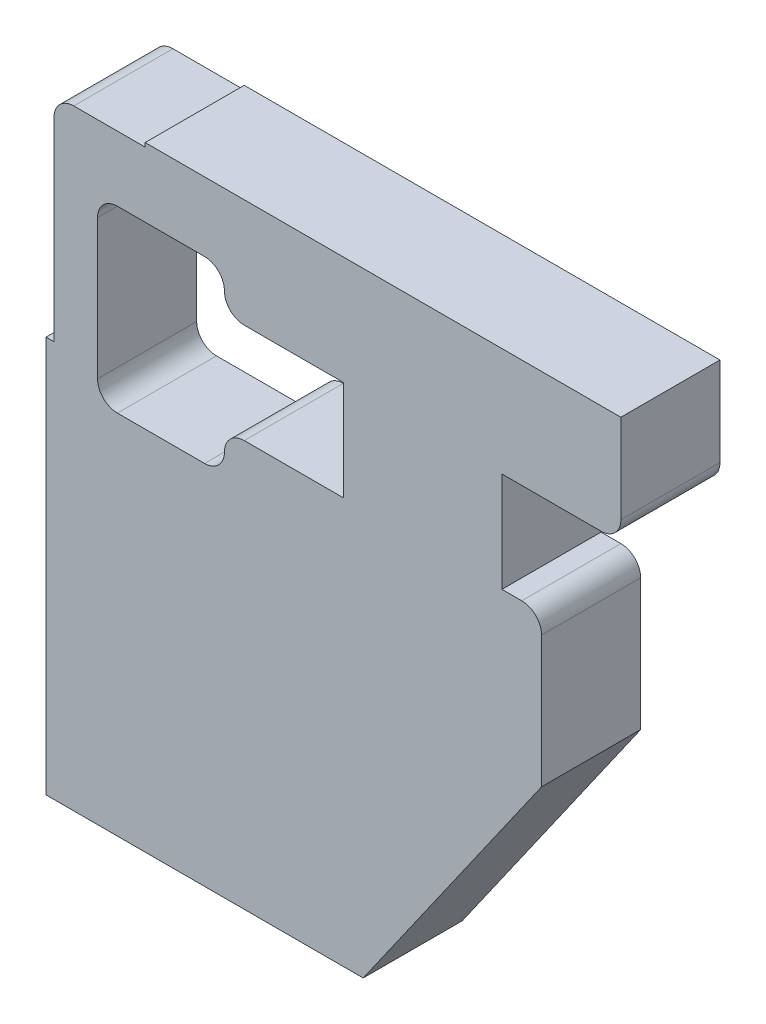
ISO-10303-21;
HEADER;
FILE_DESCRIPTION(('STEP AP214'),'2;1');
FILE_NAME('part.step','',(''),(''),'','','');
FILE_SCHEMA(('AUTOMOTIVE_DESIGN { 1 0 10303 214 1 1 1 1 }'));
ENDSEC;
DATA;
#1=APPLICATION_CONTEXT('core data for automotive mechanical design processes');
#2=APPLICATION_PROTOCOL_DEFINITION('international standard','automotive_design',2000,#1);
#3=PRODUCT_CONTEXT('',#1,'mechanical');
#4=PRODUCT('Part','Part','',(#3));
#5=PRODUCT_RELATED_PRODUCT_CATEGORY('part','',(#4));
#6=PRODUCT_DEFINITION_FORMATION('','',#4);
#7=PRODUCT_DEFINITION_CONTEXT('part definition',#1,'design');
#8=PRODUCT_DEFINITION('design','',#6,#7);
#9=PRODUCT_DEFINITION_SHAPE('','',#8);
#10=(LENGTH_UNIT() NAMED_UNIT(*) SI_UNIT(.MILLI.,.METRE.));
#11=(NAMED_UNIT(*) PLANE_ANGLE_UNIT() SI_UNIT($,.RADIAN.));
#12=(NAMED_UNIT(*) SI_UNIT($,.STERADIAN.) SOLID_ANGLE_UNIT());
#13=UNCERTAINTY_MEASURE_WITH_UNIT(LENGTH_MEASURE(1.E-05),#10,'distance_accuracy_value','');
#14=(GEOMETRIC_REPRESENTATION_CONTEXT(3) GLOBAL_UNCERTAINTY_ASSIGNED_CONTEXT((#13)) GLOBAL_UNIT_ASSIGNED_CONTEXT((#10,
#11,#12)) REPRESENTATION_CONTEXT('',''));
#15=CARTESIAN_POINT('',(0.,0.,0.));
#16=DIRECTION('',(0.,0.,1.));
#17=DIRECTION('',(1.,0.,0.));
#18=AXIS2_PLACEMENT_3D('',#15,#16,#17);
#19=CARTESIAN_POINT('',(0.,0.,0.125));
#20=DIRECTION('',(0.,0.,-1.));
#21=DIRECTION('',(-1.,0.,0.));
#22=AXIS2_PLACEMENT_3D('',#19,#20,#21);
#23=PLANE('',#22);
#24=DIRECTION('',(0.,1.,0.));
#25=VECTOR('',#24,1.);
#26=CARTESIAN_POINT('',(1.3,-0.957333396966045,0.125));
#27=LINE('',#26,#25);
#28=CARTESIAN_POINT('',(1.3,-0.957333396966045,0.125));
#29=VERTEX_POINT('',#28);
#30=CARTESIAN_POINT('',(1.3,-0.626,0.125));
#31=VERTEX_POINT('',#30);
#32=EDGE_CURVE('E290',#29,#31,#27,.T.);
#33=ORIENTED_EDGE('',*,*,#32,.T.);
#34=CARTESIAN_POINT('',(1.25,-0.626,0.125));
#35=DIRECTION('',(0.,0.,-1.));
#36=DIRECTION('',(-1.,0.,0.));
#37=AXIS2_PLACEMENT_3D('',#34,#35,#36);
#38=CIRCLE('',#37,0.05);
#39=CARTESIAN_POINT('',(1.25,-0.576,0.125));
#40=VERTEX_POINT('',#39);
#41=EDGE_CURVE('E379',#31,#40,#38,.F.);
#42=ORIENTED_EDGE('',*,*,#41,.T.);
#43=DIRECTION('',(-1.,0.,0.));
#44=VECTOR('',#43,1.);
#45=CARTESIAN_POINT('',(1.3,-0.576,0.125));
#46=LINE('',#45,#44);
#47=CARTESIAN_POINT('',(1.2,-0.576,0.125));
#48=VERTEX_POINT('',#47);
#49=EDGE_CURVE('E293',#40,#48,#46,.T.);
#50=ORIENTED_EDGE('',*,*,#49,.T.);
#51=DIRECTION('',(0.,1.,0.));
#52=VECTOR('',#51,1.);
#53=CARTESIAN_POINT('',(1.2,-0.576,0.125));
#54=LINE('',#53,#52);
#55=CARTESIAN_POINT('',(1.2,-0.324,0.125));
#56=VERTEX_POINT('',#55);
#57=EDGE_CURVE('E295',#48,#56,#54,.T.);
#58=ORIENTED_EDGE('',*,*,#57,.T.);
#59=DIRECTION('',(1.,0.,0.));
#60=VECTOR('',#59,1.);
#61=CARTESIAN_POINT('',(1.2,-0.324,0.125));
#62=LINE('',#61,#60);
#63=CARTESIAN_POINT('',(1.45,-0.324,0.125));
#64=VERTEX_POINT('',#63);
#65=EDGE_CURVE('E297',#56,#64,#62,.T.);
#66=ORIENTED_EDGE('',*,*,#65,.T.);
#67=CARTESIAN_POINT('',(1.45,-0.274,0.125));
#68=DIRECTION('',(0.,0.,-1.));
#69=DIRECTION('',(-1.,0.,0.));
#70=AXIS2_PLACEMENT_3D('',#67,#68,#69);
#71=CIRCLE('',#70,0.05);
#72=CARTESIAN_POINT('',(1.5,-0.274,0.125));
#73=VERTEX_POINT('',#72);
#74=EDGE_CURVE('E377',#64,#73,#71,.F.);
#75=ORIENTED_EDGE('',*,*,#74,.T.);
#76=DIRECTION('',(0.,1.,0.));
#77=VECTOR('',#76,1.);
#78=CARTESIAN_POINT('',(1.5,-0.324,0.125));
#79=LINE('',#78,#77);
#80=CARTESIAN_POINT('',(1.5,-0.05,0.125));
#81=VERTEX_POINT('',#80);
#82=EDGE_CURVE('E270',#73,#81,#79,.T.);
#83=ORIENTED_EDGE('',*,*,#82,.T.);
#84=DIRECTION('',(-1.,0.,0.));
#85=VECTOR('',#84,1.);
#86=CARTESIAN_POINT('',(0.3,-0.05,0.125));
#87=LINE('',#86,#85);
#88=CARTESIAN_POINT('',(0.3,-0.05,0.125));
#89=VERTEX_POINT('',#88);
#90=EDGE_CURVE('E272',#81,#89,#87,.T.);
#91=ORIENTED_EDGE('',*,*,#90,.T.);
#92=DIRECTION('',(0.,-1.,0.));
#93=VECTOR('',#92,1.);
#94=CARTESIAN_POINT('',(0.3,-0.05,0.125));
#95=LINE('',#94,#93);
#96=CARTESIAN_POINT('',(0.3,-0.06,0.125));
#97=VERTEX_POINT('',#96);
#98=EDGE_CURVE('E275',#89,#97,#95,.T.);
#99=ORIENTED_EDGE('',*,*,#98,.T.);
#100=DIRECTION('',(-1.,0.,0.));
#101=VECTOR('',#100,1.);
#102=CARTESIAN_POINT('',(0.3,-0.06,0.125));
#103=LINE('',#102,#101);
#104=CARTESIAN_POINT('',(0.12,-0.06,0.125));
#105=VERTEX_POINT('',#104);
#106=EDGE_CURVE('E277',#97,#105,#103,.T.);
#107=ORIENTED_EDGE('',*,*,#106,.T.);
#108=CARTESIAN_POINT('',(0.12,-0.11,0.125));
#109=DIRECTION('',(0.,0.,-1.));
#110=DIRECTION('',(-1.,0.,0.));
#111=AXIS2_PLACEMENT_3D('',#108,#109,#110);
#112=CIRCLE('',#111,0.05);
#113=CARTESIAN_POINT('',(0.07,-0.11,0.125));
#114=VERTEX_POINT('',#113);
#115=EDGE_CURVE('E372',#105,#114,#112,.F.);
#116=ORIENTED_EDGE('',*,*,#115,.T.);
#117=DIRECTION('',(0.,-1.,0.));
#118=VECTOR('',#117,1.);
#119=CARTESIAN_POINT('',(0.07,-0.06,0.125));
#120=LINE('',#119,#118);
#121=CARTESIAN_POINT('',(0.07,-0.6,0.125));
#122=VERTEX_POINT('',#121);
#123=EDGE_CURVE('E280',#114,#122,#120,.T.);
#124=ORIENTED_EDGE('',*,*,#123,.T.);
#125=DIRECTION('',(-1.,0.,0.));
#126=VECTOR('',#125,1.);
#127=CARTESIAN_POINT('',(0.05,-0.6,0.125));
#128=LINE('',#127,#126);
#129=CARTESIAN_POINT('',(0.05,-0.6,0.125));
#130=VERTEX_POINT('',#129);
#131=EDGE_CURVE('E282',#122,#130,#128,.T.);
#132=ORIENTED_EDGE('',*,*,#131,.T.);
#133=DIRECTION('',(0.,-1.,0.));
#134=VECTOR('',#133,1.);
#135=CARTESIAN_POINT('',(0.05,-0.6,0.125));
#136=LINE('',#135,#134);
#137=CARTESIAN_POINT('',(0.0500000000000001,-1.6,0.125));
#138=VERTEX_POINT('',#137);
#139=EDGE_CURVE('E284',#130,#138,#136,.T.);
#140=ORIENTED_EDGE('',*,*,#139,.T.);
#141=DIRECTION('',(1.,0.,0.));
#142=VECTOR('',#141,1.);
#143=CARTESIAN_POINT('',(0.0500000000000001,-1.6,0.125));
#144=LINE('',#143,#142);
#145=CARTESIAN_POINT('',(0.85,-1.6,0.125));
#146=VERTEX_POINT('',#145);
#147=EDGE_CURVE('E286',#138,#146,#144,.T.);
#148=ORIENTED_EDGE('',*,*,#147,.T.);
#149=DIRECTION('',(0.573576436351044,0.819152044288993,0.));
#150=VECTOR('',#149,1.);
#151=CARTESIAN_POINT('',(0.85,-1.6,0.125));
#152=LINE('',#151,#150);
#153=EDGE_CURVE('E288',#146,#29,#152,.T.);
#154=ORIENTED_EDGE('',*,*,#153,.T.);
#155=EDGE_LOOP('',(#33,#42,#50,#58,#66,#75,#83,#91,#99,#107,#116,#124,#132,#140,#148,#154));
#156=FACE_BOUND('',#155,.T.);
#157=DIRECTION('',(-1.,0.,0.));
#158=VECTOR('',#157,1.);
#159=CARTESIAN_POINT('',(0.18,-0.224,0.125));
#160=LINE('',#159,#158);
#161=CARTESIAN_POINT('',(0.45,-0.224,0.125));
#162=VERTEX_POINT('',#161);
#163=CARTESIAN_POINT('',(0.23,-0.224,0.125));
#164=VERTEX_POINT('',#163);
#165=EDGE_CURVE('E243',#162,#164,#160,.T.);
#166=ORIENTED_EDGE('',*,*,#165,.F.);
#167=CARTESIAN_POINT('',(0.45,-0.274,0.125));
#168=DIRECTION('',(0.,0.,-1.));
#169=DIRECTION('',(-1.,0.,0.));
#170=AXIS2_PLACEMENT_3D('',#167,#168,#169);
#171=CIRCLE('',#170,0.05);
#172=CARTESIAN_POINT('',(0.5,-0.274,0.125));
#173=VERTEX_POINT('',#172);
#174=EDGE_CURVE('E55',#162,#173,#171,.T.);
#175=ORIENTED_EDGE('',*,*,#174,.T.);
#176=CARTESIAN_POINT('',(0.55,-0.274,0.125));
#177=DIRECTION('',(0.,0.,-1.));
#178=DIRECTION('',(-1.,0.,0.));
#179=AXIS2_PLACEMENT_3D('',#176,#177,#178);
#180=CIRCLE('',#179,0.05);
#181=CARTESIAN_POINT('',(0.55,-0.324,0.125));
#182=VERTEX_POINT('',#181);
#183=EDGE_CURVE('E50',#173,#182,#180,.F.);
#184=ORIENTED_EDGE('',*,*,#183,.T.);
#185=DIRECTION('',(-1.,0.,0.));
#186=VECTOR('',#185,1.);
#187=CARTESIAN_POINT('',(0.5,-0.324,0.125));
#188=LINE('',#187,#186);
#189=CARTESIAN_POINT('',(0.8,-0.324,0.125));
#190=VERTEX_POINT('',#189);
#191=EDGE_CURVE('E241',#190,#182,#188,.T.);
#192=ORIENTED_EDGE('',*,*,#191,.F.);
#193=DIRECTION('',(0.,1.,0.));
#194=VECTOR('',#193,1.);
#195=CARTESIAN_POINT('',(0.8,-0.324,0.125));
#196=LINE('',#195,#194);
#197=CARTESIAN_POINT('',(0.8,-0.576,0.125));
#198=VERTEX_POINT('',#197);
#199=EDGE_CURVE('E229',#198,#190,#196,.T.);
#200=ORIENTED_EDGE('',*,*,#199,.F.);
#201=DIRECTION('',(1.,0.,0.));
#202=VECTOR('',#201,1.);
#203=CARTESIAN_POINT('',(0.8,-0.576,0.125));
#204=LINE('',#203,#202);
#205=CARTESIAN_POINT('',(0.55,-0.576,0.125));
#206=VERTEX_POINT('',#205);
#207=EDGE_CURVE('E221',#206,#198,#204,.T.);
#208=ORIENTED_EDGE('',*,*,#207,.F.);
#209=CARTESIAN_POINT('',(0.55,-0.626,0.125));
#210=DIRECTION('',(0.,0.,-1.));
#211=DIRECTION('',(-1.,0.,0.));
#212=AXIS2_PLACEMENT_3D('',#209,#210,#211);
#213=CIRCLE('',#212,0.05);
#214=CARTESIAN_POINT('',(0.5,-0.626,0.125));
#215=VERTEX_POINT('',#214);
#216=EDGE_CURVE('E374',#206,#215,#213,.F.);
#217=ORIENTED_EDGE('',*,*,#216,.T.);
#218=CARTESIAN_POINT('',(0.45,-0.626,0.125));
#219=DIRECTION('',(0.,0.,-1.));
#220=DIRECTION('',(-1.,0.,0.));
#221=AXIS2_PLACEMENT_3D('',#218,#219,#220);
#222=CIRCLE('',#221,0.05);
#223=CARTESIAN_POINT('',(0.45,-0.676,0.125));
#224=VERTEX_POINT('',#223);
#225=EDGE_CURVE('E411',#215,#224,#222,.T.);
#226=ORIENTED_EDGE('',*,*,#225,.T.);
#227=DIRECTION('',(1.,0.,0.));
#228=VECTOR('',#227,1.);
#229=CARTESIAN_POINT('',(0.5,-0.676,0.125));
#230=LINE('',#229,#228);
#231=CARTESIAN_POINT('',(0.23,-0.676,0.125));
#232=VERTEX_POINT('',#231);
#233=EDGE_CURVE('E251',#232,#224,#230,.T.);
#234=ORIENTED_EDGE('',*,*,#233,.F.);
#235=CARTESIAN_POINT('',(0.23,-0.626,0.125));
#236=DIRECTION('',(0.,0.,-1.));
#237=DIRECTION('',(-1.,0.,0.));
#238=AXIS2_PLACEMENT_3D('',#235,#236,#237);
#239=CIRCLE('',#238,0.05);
#240=CARTESIAN_POINT('',(0.18,-0.626,0.125));
#241=VERTEX_POINT('',#240);
#242=EDGE_CURVE('E415',#232,#241,#239,.T.);
#243=ORIENTED_EDGE('',*,*,#242,.T.);
#244=DIRECTION('',(0.,-1.,0.));
#245=VECTOR('',#244,1.);
#246=CARTESIAN_POINT('',(0.18,-0.676,0.125));
#247=LINE('',#246,#245);
#248=CARTESIAN_POINT('',(0.18,-0.274,0.125));
#249=VERTEX_POINT('',#248);
#250=EDGE_CURVE('E248',#249,#241,#247,.T.);
#251=ORIENTED_EDGE('',*,*,#250,.F.);
#252=CARTESIAN_POINT('',(0.23,-0.274,0.125));
#253=DIRECTION('',(0.,0.,-1.));
#254=DIRECTION('',(-1.,0.,0.));
#255=AXIS2_PLACEMENT_3D('',#252,#253,#254);
#256=CIRCLE('',#255,0.05);
#257=EDGE_CURVE('E11',#249,#164,#256,.T.);
#258=ORIENTED_EDGE('',*,*,#257,.T.);
#259=EDGE_LOOP('',(#166,#175,#184,#192,#200,#208,#217,#226,#234,#243,#251,#258));
#260=FACE_BOUND('',#259,.T.);
#261=ADVANCED_FACE('F33',(#156,#260),#23,.F.);
#262=CARTESIAN_POINT('',(0.,0.,-0.125));
#263=DIRECTION('',(0.,0.,-1.));
#264=DIRECTION('',(-1.,0.,0.));
#265=AXIS2_PLACEMENT_3D('',#262,#263,#264);
#266=PLANE('',#265);
#267=DIRECTION('',(-1.,0.,0.));
#268=VECTOR('',#267,1.);
#269=CARTESIAN_POINT('',(1.3,-0.576,-0.125));
#270=LINE('',#269,#268);
#271=CARTESIAN_POINT('',(1.25,-0.576,-0.125));
#272=VERTEX_POINT('',#271);
#273=CARTESIAN_POINT('',(1.2,-0.576,-0.125));
#274=VERTEX_POINT('',#273);
#275=EDGE_CURVE('E322',#272,#274,#270,.T.);
#276=ORIENTED_EDGE('',*,*,#275,.F.);
#277=CARTESIAN_POINT('',(1.25,-0.626,-0.125));
#278=DIRECTION('',(0.,0.,-1.));
#279=DIRECTION('',(-1.,0.,0.));
#280=AXIS2_PLACEMENT_3D('',#277,#278,#279);
#281=CIRCLE('',#280,0.05);
#282=CARTESIAN_POINT('',(1.3,-0.626,-0.125));
#283=VERTEX_POINT('',#282);
#284=EDGE_CURVE('E368',#272,#283,#281,.T.);
#285=ORIENTED_EDGE('',*,*,#284,.T.);
#286=DIRECTION('',(0.,1.,0.));
#287=VECTOR('',#286,1.);
#288=CARTESIAN_POINT('',(1.3,-0.957333396966045,-0.125));
#289=LINE('',#288,#287);
#290=CARTESIAN_POINT('',(1.3,-0.957333396966045,-0.125));
#291=VERTEX_POINT('',#290);
#292=EDGE_CURVE('E319',#291,#283,#289,.T.);
#293=ORIENTED_EDGE('',*,*,#292,.F.);
#294=DIRECTION('',(0.573576436351044,0.819152044288993,0.));
#295=VECTOR('',#294,1.);
#296=CARTESIAN_POINT('',(0.85,-1.6,-0.125));
#297=LINE('',#296,#295);
#298=CARTESIAN_POINT('',(0.85,-1.6,-0.125));
#299=VERTEX_POINT('',#298);
#300=EDGE_CURVE('E317',#299,#291,#297,.T.);
#301=ORIENTED_EDGE('',*,*,#300,.F.);
#302=DIRECTION('',(1.,0.,0.));
#303=VECTOR('',#302,1.);
#304=CARTESIAN_POINT('',(0.0500000000000001,-1.6,-0.125));
#305=LINE('',#304,#303);
#306=CARTESIAN_POINT('',(0.0500000000000001,-1.6,-0.125));
#307=VERTEX_POINT('',#306);
#308=EDGE_CURVE('E315',#307,#299,#305,.T.);
#309=ORIENTED_EDGE('',*,*,#308,.F.);
#310=DIRECTION('',(0.,-1.,0.));
#311=VECTOR('',#310,1.);
#312=CARTESIAN_POINT('',(0.05,-0.6,-0.125));
#313=LINE('',#312,#311);
#314=CARTESIAN_POINT('',(0.05,-0.6,-0.125));
#315=VERTEX_POINT('',#314);
#316=EDGE_CURVE('E313',#315,#307,#313,.T.);
#317=ORIENTED_EDGE('',*,*,#316,.F.);
#318=DIRECTION('',(-1.,0.,0.));
#319=VECTOR('',#318,1.);
#320=CARTESIAN_POINT('',(0.05,-0.6,-0.125));
#321=LINE('',#320,#319);
#322=CARTESIAN_POINT('',(0.07,-0.6,-0.125));
#323=VERTEX_POINT('',#322);
#324=EDGE_CURVE('E311',#323,#315,#321,.T.);
#325=ORIENTED_EDGE('',*,*,#324,.F.);
#326=DIRECTION('',(0.,-1.,0.));
#327=VECTOR('',#326,1.);
#328=CARTESIAN_POINT('',(0.07,-0.06,-0.125));
#329=LINE('',#328,#327);
#330=CARTESIAN_POINT('',(0.07,-0.11,-0.125));
#331=VERTEX_POINT('',#330);
#332=EDGE_CURVE('E309',#331,#323,#329,.T.);
#333=ORIENTED_EDGE('',*,*,#332,.F.);
#334=CARTESIAN_POINT('',(0.12,-0.11,-0.125));
#335=DIRECTION('',(0.,0.,-1.));
#336=DIRECTION('',(-1.,0.,0.));
#337=AXIS2_PLACEMENT_3D('',#334,#335,#336);
#338=CIRCLE('',#337,0.05);
#339=CARTESIAN_POINT('',(0.12,-0.06,-0.125));
#340=VERTEX_POINT('',#339);
#341=EDGE_CURVE('E360',#331,#340,#338,.T.);
#342=ORIENTED_EDGE('',*,*,#341,.T.);
#343=DIRECTION('',(-1.,0.,0.));
#344=VECTOR('',#343,1.);
#345=CARTESIAN_POINT('',(0.3,-0.06,-0.125));
#346=LINE('',#345,#344);
#347=CARTESIAN_POINT('',(0.3,-0.06,-0.125));
#348=VERTEX_POINT('',#347);
#349=EDGE_CURVE('E306',#348,#340,#346,.T.);
#350=ORIENTED_EDGE('',*,*,#349,.F.);
#351=DIRECTION('',(0.,-1.,0.));
#352=VECTOR('',#351,1.);
#353=CARTESIAN_POINT('',(0.3,-0.05,-0.125));
#354=LINE('',#353,#352);
#355=CARTESIAN_POINT('',(0.3,-0.05,-0.125));
#356=VERTEX_POINT('',#355);
#357=EDGE_CURVE('E304',#356,#348,#354,.T.);
#358=ORIENTED_EDGE('',*,*,#357,.F.);
#359=DIRECTION('',(-1.,0.,0.));
#360=VECTOR('',#359,1.);
#361=CARTESIAN_POINT('',(0.3,-0.05,-0.125));
#362=LINE('',#361,#360);
#363=CARTESIAN_POINT('',(1.5,-0.05,-0.125));
#364=VERTEX_POINT('',#363);
#365=EDGE_CURVE('E302',#364,#356,#362,.T.);
#366=ORIENTED_EDGE('',*,*,#365,.F.);
#367=DIRECTION('',(0.,1.,0.));
#368=VECTOR('',#367,1.);
#369=CARTESIAN_POINT('',(1.5,-0.324,-0.125));
#370=LINE('',#369,#368);
#371=CARTESIAN_POINT('',(1.5,-0.274,-0.125));
#372=VERTEX_POINT('',#371);
#373=EDGE_CURVE('E238',#372,#364,#370,.T.);
#374=ORIENTED_EDGE('',*,*,#373,.F.);
#375=CARTESIAN_POINT('',(1.45,-0.274,-0.125));
#376=DIRECTION('',(0.,0.,-1.));
#377=DIRECTION('',(-1.,0.,0.));
#378=AXIS2_PLACEMENT_3D('',#375,#376,#377);
#379=CIRCLE('',#378,0.05);
#380=CARTESIAN_POINT('',(1.45,-0.324,-0.125));
#381=VERTEX_POINT('',#380);
#382=EDGE_CURVE('E366',#372,#381,#379,.T.);
#383=ORIENTED_EDGE('',*,*,#382,.T.);
#384=DIRECTION('',(1.,0.,0.));
#385=VECTOR('',#384,1.);
#386=CARTESIAN_POINT('',(1.2,-0.324,-0.125));
#387=LINE('',#386,#385);
#388=CARTESIAN_POINT('',(1.2,-0.324,-0.125));
#389=VERTEX_POINT('',#388);
#390=EDGE_CURVE('E273',#389,#381,#387,.T.);
#391=ORIENTED_EDGE('',*,*,#390,.F.);
#392=DIRECTION('',(0.,1.,0.));
#393=VECTOR('',#392,1.);
#394=CARTESIAN_POINT('',(1.2,-0.576,-0.125));
#395=LINE('',#394,#393);
#396=EDGE_CURVE('E324',#274,#389,#395,.T.);
#397=ORIENTED_EDGE('',*,*,#396,.F.);
#398=EDGE_LOOP('',(#276,#285,#293,#301,#309,#317,#325,#333,#342,#350,#358,#366,#374,#383,#391,#397));
#399=FACE_BOUND('',#398,.T.);
#400=DIRECTION('',(-1.,0.,0.));
#401=VECTOR('',#400,1.);
#402=CARTESIAN_POINT('',(0.5,-0.324,-0.125));
#403=LINE('',#402,#401);
#404=CARTESIAN_POINT('',(0.8,-0.324,-0.125));
#405=VERTEX_POINT('',#404);
#406=CARTESIAN_POINT('',(0.55,-0.324,-0.125));
#407=VERTEX_POINT('',#406);
#408=EDGE_CURVE('E258',#405,#407,#403,.T.);
#409=ORIENTED_EDGE('',*,*,#408,.T.);
#410=CARTESIAN_POINT('',(0.55,-0.274,-0.125));
#411=DIRECTION('',(0.,0.,-1.));
#412=DIRECTION('',(-1.,0.,0.));
#413=AXIS2_PLACEMENT_3D('',#410,#411,#412);
#414=CIRCLE('',#413,0.05);
#415=CARTESIAN_POINT('',(0.5,-0.274,-0.125));
#416=VERTEX_POINT('',#415);
#417=EDGE_CURVE('E364',#407,#416,#414,.T.);
#418=ORIENTED_EDGE('',*,*,#417,.T.);
#419=CARTESIAN_POINT('',(0.45,-0.274,-0.125));
#420=DIRECTION('',(0.,0.,-1.));
#421=DIRECTION('',(-1.,0.,0.));
#422=AXIS2_PLACEMENT_3D('',#419,#420,#421);
#423=CIRCLE('',#422,0.05);
#424=CARTESIAN_POINT('',(0.45,-0.224,-0.125));
#425=VERTEX_POINT('',#424);
#426=EDGE_CURVE('E417',#416,#425,#423,.F.);
#427=ORIENTED_EDGE('',*,*,#426,.T.);
#428=DIRECTION('',(-1.,0.,0.));
#429=VECTOR('',#428,1.);
#430=CARTESIAN_POINT('',(0.18,-0.224,-0.125));
#431=LINE('',#430,#429);
#432=CARTESIAN_POINT('',(0.23,-0.224,-0.125));
#433=VERTEX_POINT('',#432);
#434=EDGE_CURVE('E261',#425,#433,#431,.T.);
#435=ORIENTED_EDGE('',*,*,#434,.T.);
#436=CARTESIAN_POINT('',(0.23,-0.274,-0.125));
#437=DIRECTION('',(0.,0.,-1.));
#438=DIRECTION('',(-1.,0.,0.));
#439=AXIS2_PLACEMENT_3D('',#436,#437,#438);
#440=CIRCLE('',#439,0.05);
#441=CARTESIAN_POINT('',(0.18,-0.274,-0.125));
#442=VERTEX_POINT('',#441);
#443=EDGE_CURVE('E42',#433,#442,#440,.F.);
#444=ORIENTED_EDGE('',*,*,#443,.T.);
#445=DIRECTION('',(0.,-1.,0.));
#446=VECTOR('',#445,1.);
#447=CARTESIAN_POINT('',(0.18,-0.676,-0.125));
#448=LINE('',#447,#446);
#449=CARTESIAN_POINT('',(0.18,-0.626,-0.125));
#450=VERTEX_POINT('',#449);
#451=EDGE_CURVE('E264',#442,#450,#448,.T.);
#452=ORIENTED_EDGE('',*,*,#451,.T.);
#453=CARTESIAN_POINT('',(0.23,-0.626,-0.125));
#454=DIRECTION('',(0.,0.,-1.));
#455=DIRECTION('',(-1.,0.,0.));
#456=AXIS2_PLACEMENT_3D('',#453,#454,#455);
#457=CIRCLE('',#456,0.05);
#458=CARTESIAN_POINT('',(0.23,-0.676,-0.125));
#459=VERTEX_POINT('',#458);
#460=EDGE_CURVE('E413',#450,#459,#457,.F.);
#461=ORIENTED_EDGE('',*,*,#460,.T.);
#462=DIRECTION('',(1.,0.,0.));
#463=VECTOR('',#462,1.);
#464=CARTESIAN_POINT('',(0.5,-0.676,-0.125));
#465=LINE('',#464,#463);
#466=CARTESIAN_POINT('',(0.45,-0.676,-0.125));
#467=VERTEX_POINT('',#466);
#468=EDGE_CURVE('E230',#459,#467,#465,.T.);
#469=ORIENTED_EDGE('',*,*,#468,.T.);
#470=CARTESIAN_POINT('',(0.45,-0.626,-0.125));
#471=DIRECTION('',(0.,0.,-1.));
#472=DIRECTION('',(-1.,0.,0.));
#473=AXIS2_PLACEMENT_3D('',#470,#471,#472);
#474=CIRCLE('',#473,0.05);
#475=CARTESIAN_POINT('',(0.5,-0.626,-0.125));
#476=VERTEX_POINT('',#475);
#477=EDGE_CURVE('E409',#467,#476,#474,.F.);
#478=ORIENTED_EDGE('',*,*,#477,.T.);
#479=CARTESIAN_POINT('',(0.55,-0.626,-0.125));
#480=DIRECTION('',(0.,0.,-1.));
#481=DIRECTION('',(-1.,0.,0.));
#482=AXIS2_PLACEMENT_3D('',#479,#480,#481);
#483=CIRCLE('',#482,0.05);
#484=CARTESIAN_POINT('',(0.55,-0.576,-0.125));
#485=VERTEX_POINT('',#484);
#486=EDGE_CURVE('E362',#476,#485,#483,.T.);
#487=ORIENTED_EDGE('',*,*,#486,.T.);
#488=DIRECTION('',(1.,0.,0.));
#489=VECTOR('',#488,1.);
#490=CARTESIAN_POINT('',(0.8,-0.576,-0.125));
#491=LINE('',#490,#489);
#492=CARTESIAN_POINT('',(0.8,-0.576,-0.125));
#493=VERTEX_POINT('',#492);
#494=EDGE_CURVE('E254',#485,#493,#491,.T.);
#495=ORIENTED_EDGE('',*,*,#494,.T.);
#496=DIRECTION('',(0.,1.,0.));
#497=VECTOR('',#496,1.);
#498=CARTESIAN_POINT('',(0.8,-0.324,-0.125));
#499=LINE('',#498,#497);
#500=EDGE_CURVE('E237',#493,#405,#499,.T.);
#501=ORIENTED_EDGE('',*,*,#500,.T.);
#502=EDGE_LOOP('',(#409,#418,#427,#435,#444,#452,#461,#469,#478,#487,#495,#501));
#503=FACE_BOUND('',#502,.T.);
#504=ADVANCED_FACE('F463',(#399,#503),#266,.T.);
#505=CARTESIAN_POINT('',(1.5,-0.324,0.125));
#506=DIRECTION('',(-1.,0.,0.));
#507=DIRECTION('',(0.,-1.,0.));
#508=AXIS2_PLACEMENT_3D('',#505,#506,#507);
#509=PLANE('',#508);
#510=ORIENTED_EDGE('',*,*,#82,.F.);
#511=DIRECTION('',(0.,0.,-1.));
#512=VECTOR('',#511,1.);
#513=CARTESIAN_POINT('',(1.5,-0.274,0.125));
#514=LINE('',#513,#512);
#515=EDGE_CURVE('E381',#73,#372,#514,.T.);
#516=ORIENTED_EDGE('',*,*,#515,.T.);
#517=ORIENTED_EDGE('',*,*,#373,.T.);
#518=DIRECTION('',(0.,0.,-1.));
#519=VECTOR('',#518,1.);
#520=CARTESIAN_POINT('',(1.5,-0.05,0.125));
#521=LINE('',#520,#519);
#522=EDGE_CURVE('E354',#81,#364,#521,.T.);
#523=ORIENTED_EDGE('',*,*,#522,.F.);
#524=EDGE_LOOP('',(#510,#516,#517,#523));
#525=FACE_BOUND('',#524,.T.);
#526=ADVANCED_FACE('F465',(#525),#509,.F.);
#527=CARTESIAN_POINT('',(0.3,-0.05,0.125));
#528=DIRECTION('',(0.,-1.,0.));
#529=DIRECTION('',(1.,0.,0.));
#530=AXIS2_PLACEMENT_3D('',#527,#528,#529);
#531=PLANE('',#530);
#532=ORIENTED_EDGE('',*,*,#365,.T.);
#533=DIRECTION('',(0.,0.,-1.));
#534=VECTOR('',#533,1.);
#535=CARTESIAN_POINT('',(0.3,-0.05,0.125));
#536=LINE('',#535,#534);
#537=EDGE_CURVE('E351',#89,#356,#536,.T.);
#538=ORIENTED_EDGE('',*,*,#537,.F.);
#539=ORIENTED_EDGE('',*,*,#90,.F.);
#540=ORIENTED_EDGE('',*,*,#522,.T.);
#541=EDGE_LOOP('',(#532,#538,#539,#540));
#542=FACE_BOUND('',#541,.T.);
#543=ADVANCED_FACE('F472',(#542),#531,.F.);
#544=CARTESIAN_POINT('',(0.3,-0.05,0.125));
#545=DIRECTION('',(1.,0.,0.));
#546=DIRECTION('',(0.,0.,-1.));
#547=AXIS2_PLACEMENT_3D('',#544,#545,#546);
#548=PLANE('',#547);
#549=ORIENTED_EDGE('',*,*,#357,.T.);
#550=DIRECTION('',(0.,0.,-1.));
#551=VECTOR('',#550,1.);
#552=CARTESIAN_POINT('',(0.3,-0.06,0.125));
#553=LINE('',#552,#551);
#554=EDGE_CURVE('E348',#97,#348,#553,.T.);
#555=ORIENTED_EDGE('',*,*,#554,.F.);
#556=ORIENTED_EDGE('',*,*,#98,.F.);
#557=ORIENTED_EDGE('',*,*,#537,.T.);
#558=EDGE_LOOP('',(#549,#555,#556,#557));
#559=FACE_BOUND('',#558,.T.);
#560=ADVANCED_FACE('F519',(#559),#548,.F.);
#561=CARTESIAN_POINT('',(0.3,-0.06,0.125));
#562=DIRECTION('',(0.,-1.,0.));
#563=DIRECTION('',(0.,0.,-1.));
#564=AXIS2_PLACEMENT_3D('',#561,#562,#563);
#565=PLANE('',#564);
#566=ORIENTED_EDGE('',*,*,#349,.T.);
#567=DIRECTION('',(0.,0.,-1.));
#568=VECTOR('',#567,1.);
#569=CARTESIAN_POINT('',(0.12,-0.06,0.125));
#570=LINE('',#569,#568);
#571=EDGE_CURVE('E407',#340,#105,#570,.F.);
#572=ORIENTED_EDGE('',*,*,#571,.T.);
#573=ORIENTED_EDGE('',*,*,#106,.F.);
#574=ORIENTED_EDGE('',*,*,#554,.T.);
#575=EDGE_LOOP('',(#566,#572,#573,#574));
#576=FACE_BOUND('',#575,.T.);
#577=ADVANCED_FACE('F515',(#576),#565,.F.);
#578=CARTESIAN_POINT('',(0.07,-0.06,0.125));
#579=DIRECTION('',(1.,0.,0.));
#580=DIRECTION('',(0.,0.,-1.));
#581=AXIS2_PLACEMENT_3D('',#578,#579,#580);
#582=PLANE('',#581);
#583=ORIENTED_EDGE('',*,*,#123,.F.);
#584=DIRECTION('',(0.,0.,-1.));
#585=VECTOR('',#584,1.);
#586=CARTESIAN_POINT('',(0.07,-0.11,0.125));
#587=LINE('',#586,#585);
#588=EDGE_CURVE('E404',#114,#331,#587,.T.);
#589=ORIENTED_EDGE('',*,*,#588,.T.);
#590=ORIENTED_EDGE('',*,*,#332,.T.);
#591=DIRECTION('',(0.,0.,-1.));
#592=VECTOR('',#591,1.);
#593=CARTESIAN_POINT('',(0.07,-0.6,0.125));
#594=LINE('',#593,#592);
#595=EDGE_CURVE('E345',#122,#323,#594,.T.);
#596=ORIENTED_EDGE('',*,*,#595,.F.);
#597=EDGE_LOOP('',(#583,#589,#590,#596));
#598=FACE_BOUND('',#597,.T.);
#599=ADVANCED_FACE('F511',(#598),#582,.F.);
#600=CARTESIAN_POINT('',(0.05,-0.6,0.125));
#601=DIRECTION('',(0.,-1.,0.));
#602=DIRECTION('',(0.,0.,-1.));
#603=AXIS2_PLACEMENT_3D('',#600,#601,#602);
#604=PLANE('',#603);
#605=ORIENTED_EDGE('',*,*,#324,.T.);
#606=DIRECTION('',(0.,0.,-1.));
#607=VECTOR('',#606,1.);
#608=CARTESIAN_POINT('',(0.05,-0.6,0.125));
#609=LINE('',#608,#607);
#610=EDGE_CURVE('E342',#130,#315,#609,.T.);
#611=ORIENTED_EDGE('',*,*,#610,.F.);
#612=ORIENTED_EDGE('',*,*,#131,.F.);
#613=ORIENTED_EDGE('',*,*,#595,.T.);
#614=EDGE_LOOP('',(#605,#611,#612,#613));
#615=FACE_BOUND('',#614,.T.);
#616=ADVANCED_FACE('F507',(#615),#604,.F.);
#617=CARTESIAN_POINT('',(0.05,-0.6,0.125));
#618=DIRECTION('',(1.,0.,0.));
#619=DIRECTION('',(0.,1.,0.));
#620=AXIS2_PLACEMENT_3D('',#617,#618,#619);
#621=PLANE('',#620);
#622=ORIENTED_EDGE('',*,*,#316,.T.);
#623=DIRECTION('',(0.,0.,-1.));
#624=VECTOR('',#623,1.);
#625=CARTESIAN_POINT('',(0.0500000000000001,-1.6,0.125));
#626=LINE('',#625,#624);
#627=EDGE_CURVE('E339',#138,#307,#626,.T.);
#628=ORIENTED_EDGE('',*,*,#627,.F.);
#629=ORIENTED_EDGE('',*,*,#139,.F.);
#630=ORIENTED_EDGE('',*,*,#610,.T.);
#631=EDGE_LOOP('',(#622,#628,#629,#630));
#632=FACE_BOUND('',#631,.T.);
#633=ADVANCED_FACE('F503',(#632),#621,.F.);
#634=CARTESIAN_POINT('',(0.0500000000000001,-1.6,0.125));
#635=DIRECTION('',(0.,1.,0.));
#636=DIRECTION('',(0.,0.,1.));
#637=AXIS2_PLACEMENT_3D('',#634,#635,#636);
#638=PLANE('',#637);
#639=ORIENTED_EDGE('',*,*,#308,.T.);
#640=DIRECTION('',(0.,0.,-1.));
#641=VECTOR('',#640,1.);
#642=CARTESIAN_POINT('',(0.85,-1.6,0.125));
#643=LINE('',#642,#641);
#644=EDGE_CURVE('E336',#146,#299,#643,.T.);
#645=ORIENTED_EDGE('',*,*,#644,.F.);
#646=ORIENTED_EDGE('',*,*,#147,.F.);
#647=ORIENTED_EDGE('',*,*,#627,.T.);
#648=EDGE_LOOP('',(#639,#645,#646,#647));
#649=FACE_BOUND('',#648,.T.);
#650=ADVANCED_FACE('F499',(#649),#638,.F.);
#651=CARTESIAN_POINT('',(0.85,-1.6,0.125));
#652=DIRECTION('',(-0.819152044288993,0.573576436351044,0.));
#653=DIRECTION('',(-0.573576436351044,-0.819152044288993,0.));
#654=AXIS2_PLACEMENT_3D('',#651,#652,#653);
#655=PLANE('',#654);
#656=ORIENTED_EDGE('',*,*,#300,.T.);
#657=DIRECTION('',(0.,0.,-1.));
#658=VECTOR('',#657,1.);
#659=CARTESIAN_POINT('',(1.3,-0.957333396966045,0.125));
#660=LINE('',#659,#658);
#661=EDGE_CURVE('E333',#29,#291,#660,.T.);
#662=ORIENTED_EDGE('',*,*,#661,.F.);
#663=ORIENTED_EDGE('',*,*,#153,.F.);
#664=ORIENTED_EDGE('',*,*,#644,.T.);
#665=EDGE_LOOP('',(#656,#662,#663,#664));
#666=FACE_BOUND('',#665,.T.);
#667=ADVANCED_FACE('F495',(#666),#655,.F.);
#668=CARTESIAN_POINT('',(1.3,-0.957333396966045,0.125));
#669=DIRECTION('',(-1.,0.,0.));
#670=DIRECTION('',(0.,0.,1.));
#671=AXIS2_PLACEMENT_3D('',#668,#669,#670);
#672=PLANE('',#671);
#673=ORIENTED_EDGE('',*,*,#292,.T.);
#674=DIRECTION('',(0.,0.,-1.));
#675=VECTOR('',#674,1.);
#676=CARTESIAN_POINT('',(1.3,-0.626,0.125));
#677=LINE('',#676,#675);
#678=EDGE_CURVE('E370',#283,#31,#677,.F.);
#679=ORIENTED_EDGE('',*,*,#678,.T.);
#680=ORIENTED_EDGE('',*,*,#32,.F.);
#681=ORIENTED_EDGE('',*,*,#661,.T.);
#682=EDGE_LOOP('',(#673,#679,#680,#681));
#683=FACE_BOUND('',#682,.T.);
#684=ADVANCED_FACE('F491',(#683),#672,.F.);
#685=CARTESIAN_POINT('',(1.3,-0.576,0.125));
#686=DIRECTION('',(0.,-1.,0.));
#687=DIRECTION('',(0.,0.,-1.));
#688=AXIS2_PLACEMENT_3D('',#685,#686,#687);
#689=PLANE('',#688);
#690=ORIENTED_EDGE('',*,*,#49,.F.);
#691=DIRECTION('',(0.,0.,-1.));
#692=VECTOR('',#691,1.);
#693=CARTESIAN_POINT('',(1.25,-0.576,0.125));
#694=LINE('',#693,#692);
#695=EDGE_CURVE('E357',#40,#272,#694,.T.);
#696=ORIENTED_EDGE('',*,*,#695,.T.);
#697=ORIENTED_EDGE('',*,*,#275,.T.);
#698=DIRECTION('',(0.,0.,-1.));
#699=VECTOR('',#698,1.);
#700=CARTESIAN_POINT('',(1.2,-0.576,0.125));
#701=LINE('',#700,#699);
#702=EDGE_CURVE('E330',#48,#274,#701,.T.);
#703=ORIENTED_EDGE('',*,*,#702,.F.);
#704=EDGE_LOOP('',(#690,#696,#697,#703));
#705=FACE_BOUND('',#704,.T.);
#706=ADVANCED_FACE('F487',(#705),#689,.F.);
#707=CARTESIAN_POINT('',(1.2,-0.576,0.125));
#708=DIRECTION('',(-1.,0.,0.));
#709=DIRECTION('',(0.,0.,1.));
#710=AXIS2_PLACEMENT_3D('',#707,#708,#709);
#711=PLANE('',#710);
#712=ORIENTED_EDGE('',*,*,#396,.T.);
#713=DIRECTION('',(0.,0.,-1.));
#714=VECTOR('',#713,1.);
#715=CARTESIAN_POINT('',(1.2,-0.324,0.125));
#716=LINE('',#715,#714);
#717=EDGE_CURVE('E300',#56,#389,#716,.T.);
#718=ORIENTED_EDGE('',*,*,#717,.F.);
#719=ORIENTED_EDGE('',*,*,#57,.F.);
#720=ORIENTED_EDGE('',*,*,#702,.T.);
#721=EDGE_LOOP('',(#712,#718,#719,#720));
#722=FACE_BOUND('',#721,.T.);
#723=ADVANCED_FACE('F483',(#722),#711,.F.);
#724=CARTESIAN_POINT('',(1.2,-0.324,0.125));
#725=DIRECTION('',(0.,1.,0.));
#726=DIRECTION('',(0.,0.,1.));
#727=AXIS2_PLACEMENT_3D('',#724,#725,#726);
#728=PLANE('',#727);
#729=ORIENTED_EDGE('',*,*,#390,.T.);
#730=DIRECTION('',(0.,0.,-1.));
#731=VECTOR('',#730,1.);
#732=CARTESIAN_POINT('',(1.45,-0.324,0.125));
#733=LINE('',#732,#731);
#734=EDGE_CURVE('E384',#381,#64,#733,.F.);
#735=ORIENTED_EDGE('',*,*,#734,.T.);
#736=ORIENTED_EDGE('',*,*,#65,.F.);
#737=ORIENTED_EDGE('',*,*,#717,.T.);
#738=EDGE_LOOP('',(#729,#735,#736,#737));
#739=FACE_BOUND('',#738,.T.);
#740=ADVANCED_FACE('F480',(#739),#728,.F.);
#741=CARTESIAN_POINT('',(0.8,-0.576,0.125));
#742=DIRECTION('',(0.,1.,0.));
#743=DIRECTION('',(-1.,0.,0.));
#744=AXIS2_PLACEMENT_3D('',#741,#742,#743);
#745=PLANE('',#744);
#746=ORIENTED_EDGE('',*,*,#494,.F.);
#747=DIRECTION('',(0.,0.,-1.));
#748=VECTOR('',#747,1.);
#749=CARTESIAN_POINT('',(0.55,-0.576,0.125));
#750=LINE('',#749,#748);
#751=EDGE_CURVE('E227',#485,#206,#750,.F.);
#752=ORIENTED_EDGE('',*,*,#751,.T.);
#753=ORIENTED_EDGE('',*,*,#207,.T.);
#754=DIRECTION('',(0.,0.,-1.));
#755=VECTOR('',#754,1.);
#756=CARTESIAN_POINT('',(0.8,-0.576,0.125));
#757=LINE('',#756,#755);
#758=EDGE_CURVE('E225',#198,#493,#757,.T.);
#759=ORIENTED_EDGE('',*,*,#758,.T.);
#760=EDGE_LOOP('',(#746,#752,#753,#759));
#761=FACE_BOUND('',#760,.T.);
#762=ADVANCED_FACE('F224',(#761),#745,.T.);
#763=CARTESIAN_POINT('',(0.8,-0.324,0.125));
#764=DIRECTION('',(-1.,0.,0.));
#765=DIRECTION('',(0.,0.,1.));
#766=AXIS2_PLACEMENT_3D('',#763,#764,#765);
#767=PLANE('',#766);
#768=ORIENTED_EDGE('',*,*,#500,.F.);
#769=ORIENTED_EDGE('',*,*,#758,.F.);
#770=ORIENTED_EDGE('',*,*,#199,.T.);
#771=DIRECTION('',(0.,0.,-1.));
#772=VECTOR('',#771,1.);
#773=CARTESIAN_POINT('',(0.8,-0.324,0.125));
#774=LINE('',#773,#772);
#775=EDGE_CURVE('E239',#190,#405,#774,.T.);
#776=ORIENTED_EDGE('',*,*,#775,.T.);
#777=EDGE_LOOP('',(#768,#769,#770,#776));
#778=FACE_BOUND('',#777,.T.);
#779=ADVANCED_FACE('F234',(#778),#767,.T.);
#780=CARTESIAN_POINT('',(0.5,-0.324,0.125));
#781=DIRECTION('',(0.,-1.,0.));
#782=DIRECTION('',(1.,0.,0.));
#783=AXIS2_PLACEMENT_3D('',#780,#781,#782);
#784=PLANE('',#783);
#785=ORIENTED_EDGE('',*,*,#191,.T.);
#786=DIRECTION('',(0.,0.,-1.));
#787=VECTOR('',#786,1.);
#788=CARTESIAN_POINT('',(0.55,-0.324,0.125));
#789=LINE('',#788,#787);
#790=EDGE_CURVE('E386',#182,#407,#789,.T.);
#791=ORIENTED_EDGE('',*,*,#790,.T.);
#792=ORIENTED_EDGE('',*,*,#408,.F.);
#793=ORIENTED_EDGE('',*,*,#775,.F.);
#794=EDGE_LOOP('',(#785,#791,#792,#793));
#795=FACE_BOUND('',#794,.T.);
#796=ADVANCED_FACE('F461',(#795),#784,.T.);
#797=CARTESIAN_POINT('',(0.18,-0.224,0.125));
#798=DIRECTION('',(0.,-1.,0.));
#799=DIRECTION('',(1.,0.,0.));
#800=AXIS2_PLACEMENT_3D('',#797,#798,#799);
#801=PLANE('',#800);
#802=ORIENTED_EDGE('',*,*,#434,.F.);
#803=DIRECTION('',(0.,0.,-1.));
#804=VECTOR('',#803,1.);
#805=CARTESIAN_POINT('',(0.45,-0.224,0.125));
#806=LINE('',#805,#804);
#807=EDGE_CURVE('E402',#425,#162,#806,.F.);
#808=ORIENTED_EDGE('',*,*,#807,.T.);
#809=ORIENTED_EDGE('',*,*,#165,.T.);
#810=DIRECTION('',(0.,0.,-1.));
#811=VECTOR('',#810,1.);
#812=CARTESIAN_POINT('',(0.23,-0.224,-0.125));
#813=LINE('',#812,#811);
#814=EDGE_CURVE('E399',#164,#433,#813,.T.);
#815=ORIENTED_EDGE('',*,*,#814,.T.);
#816=EDGE_LOOP('',(#802,#808,#809,#815));
#817=FACE_BOUND('',#816,.T.);
#818=ADVANCED_FACE('F452',(#817),#801,.T.);
#819=CARTESIAN_POINT('',(0.18,-0.676,0.125));
#820=DIRECTION('',(1.,0.,0.));
#821=DIRECTION('',(0.,0.,-1.));
#822=AXIS2_PLACEMENT_3D('',#819,#820,#821);
#823=PLANE('',#822);
#824=ORIENTED_EDGE('',*,*,#250,.T.);
#825=DIRECTION('',(0.,0.,-1.));
#826=VECTOR('',#825,1.);
#827=CARTESIAN_POINT('',(0.18,-0.626,-0.125));
#828=LINE('',#827,#826);
#829=EDGE_CURVE('E396',#241,#450,#828,.T.);
#830=ORIENTED_EDGE('',*,*,#829,.T.);
#831=ORIENTED_EDGE('',*,*,#451,.F.);
#832=DIRECTION('',(0.,0.,-1.));
#833=VECTOR('',#832,1.);
#834=CARTESIAN_POINT('',(0.18,-0.274,0.125));
#835=LINE('',#834,#833);
#836=EDGE_CURVE('E394',#442,#249,#835,.F.);
#837=ORIENTED_EDGE('',*,*,#836,.T.);
#838=EDGE_LOOP('',(#824,#830,#831,#837));
#839=FACE_BOUND('',#838,.T.);
#840=ADVANCED_FACE('F444',(#839),#823,.T.);
#841=CARTESIAN_POINT('',(0.5,-0.676,0.125));
#842=DIRECTION('',(0.,1.,0.));
#843=DIRECTION('',(-1.,0.,0.));
#844=AXIS2_PLACEMENT_3D('',#841,#842,#843);
#845=PLANE('',#844);
#846=ORIENTED_EDGE('',*,*,#233,.T.);
#847=DIRECTION('',(0.,0.,-1.));
#848=VECTOR('',#847,1.);
#849=CARTESIAN_POINT('',(0.45,-0.676,-0.125));
#850=LINE('',#849,#848);
#851=EDGE_CURVE('E392',#224,#467,#850,.T.);
#852=ORIENTED_EDGE('',*,*,#851,.T.);
#853=ORIENTED_EDGE('',*,*,#468,.F.);
#854=DIRECTION('',(0.,0.,-1.));
#855=VECTOR('',#854,1.);
#856=CARTESIAN_POINT('',(0.23,-0.676,0.125));
#857=LINE('',#856,#855);
#858=EDGE_CURVE('E390',#459,#232,#857,.F.);
#859=ORIENTED_EDGE('',*,*,#858,.T.);
#860=EDGE_LOOP('',(#846,#852,#853,#859));
#861=FACE_BOUND('',#860,.T.);
#862=ADVANCED_FACE('F435',(#861),#845,.T.);
#863=CARTESIAN_POINT('',(1.25,-0.626,0.125));
#864=DIRECTION('',(0.,0.,-1.));
#865=DIRECTION('',(-1.,0.,0.));
#866=AXIS2_PLACEMENT_3D('',#863,#864,#865);
#867=CYLINDRICAL_SURFACE('',#866,0.05);
#868=ORIENTED_EDGE('',*,*,#41,.F.);
#869=ORIENTED_EDGE('',*,*,#678,.F.);
#870=ORIENTED_EDGE('',*,*,#284,.F.);
#871=ORIENTED_EDGE('',*,*,#695,.F.);
#872=EDGE_LOOP('',(#868,#869,#870,#871));
#873=FACE_BOUND('',#872,.T.);
#874=ADVANCED_FACE('F527',(#873),#867,.T.);
#875=CARTESIAN_POINT('',(1.45,-0.274,0.125));
#876=DIRECTION('',(0.,0.,-1.));
#877=DIRECTION('',(-1.,0.,0.));
#878=AXIS2_PLACEMENT_3D('',#875,#876,#877);
#879=CYLINDRICAL_SURFACE('',#878,0.05);
#880=ORIENTED_EDGE('',*,*,#74,.F.);
#881=ORIENTED_EDGE('',*,*,#734,.F.);
#882=ORIENTED_EDGE('',*,*,#382,.F.);
#883=ORIENTED_EDGE('',*,*,#515,.F.);
#884=EDGE_LOOP('',(#880,#881,#882,#883));
#885=FACE_BOUND('',#884,.T.);
#886=ADVANCED_FACE('F530',(#885),#879,.T.);
#887=CARTESIAN_POINT('',(0.45,-0.274,0.125));
#888=DIRECTION('',(0.,0.,1.));
#889=DIRECTION('',(1.,0.,0.));
#890=AXIS2_PLACEMENT_3D('',#887,#888,#889);
#891=CYLINDRICAL_SURFACE('',#890,0.05);
#892=DIRECTION('',(0.,0.,-1.));
#893=VECTOR('',#892,1.);
#894=CARTESIAN_POINT('',(0.5,-0.274,-0.125));
#895=LINE('',#894,#893);
#896=EDGE_CURVE('E256',#173,#416,#895,.T.);
#897=ORIENTED_EDGE('',*,*,#896,.F.);
#898=ORIENTED_EDGE('',*,*,#174,.F.);
#899=ORIENTED_EDGE('',*,*,#807,.F.);
#900=ORIENTED_EDGE('',*,*,#426,.F.);
#901=EDGE_LOOP('',(#897,#898,#899,#900));
#902=FACE_BOUND('',#901,.T.);
#903=ADVANCED_FACE('F456',(#902),#891,.F.);
#904=CARTESIAN_POINT('',(0.55,-0.274,0.125));
#905=DIRECTION('',(0.,0.,-1.));
#906=DIRECTION('',(-1.,0.,0.));
#907=AXIS2_PLACEMENT_3D('',#904,#905,#906);
#908=CYLINDRICAL_SURFACE('',#907,0.05);
#909=ORIENTED_EDGE('',*,*,#183,.F.);
#910=ORIENTED_EDGE('',*,*,#896,.T.);
#911=ORIENTED_EDGE('',*,*,#417,.F.);
#912=ORIENTED_EDGE('',*,*,#790,.F.);
#913=EDGE_LOOP('',(#909,#910,#911,#912));
#914=FACE_BOUND('',#913,.T.);
#915=ADVANCED_FACE('F458',(#914),#908,.T.);
#916=CARTESIAN_POINT('',(0.45,-0.626,0.125));
#917=DIRECTION('',(0.,0.,1.));
#918=DIRECTION('',(1.,0.,0.));
#919=AXIS2_PLACEMENT_3D('',#916,#917,#918);
#920=CYLINDRICAL_SURFACE('',#919,0.05);
#921=ORIENTED_EDGE('',*,*,#851,.F.);
#922=ORIENTED_EDGE('',*,*,#225,.F.);
#923=DIRECTION('',(0.,0.,-1.));
#924=VECTOR('',#923,1.);
#925=CARTESIAN_POINT('',(0.5,-0.626,0.125));
#926=LINE('',#925,#924);
#927=EDGE_CURVE('E37',#476,#215,#926,.F.);
#928=ORIENTED_EDGE('',*,*,#927,.F.);
#929=ORIENTED_EDGE('',*,*,#477,.F.);
#930=EDGE_LOOP('',(#921,#922,#928,#929));
#931=FACE_BOUND('',#930,.T.);
#932=ADVANCED_FACE('F431',(#931),#920,.F.);
#933=CARTESIAN_POINT('',(0.55,-0.626,0.125));
#934=DIRECTION('',(0.,0.,-1.));
#935=DIRECTION('',(-1.,0.,0.));
#936=AXIS2_PLACEMENT_3D('',#933,#934,#935);
#937=CYLINDRICAL_SURFACE('',#936,0.05);
#938=ORIENTED_EDGE('',*,*,#216,.F.);
#939=ORIENTED_EDGE('',*,*,#751,.F.);
#940=ORIENTED_EDGE('',*,*,#486,.F.);
#941=ORIENTED_EDGE('',*,*,#927,.T.);
#942=EDGE_LOOP('',(#938,#939,#940,#941));
#943=FACE_BOUND('',#942,.T.);
#944=ADVANCED_FACE('F426',(#943),#937,.T.);
#945=CARTESIAN_POINT('',(0.23,-0.626,0.125));
#946=DIRECTION('',(0.,0.,1.));
#947=DIRECTION('',(1.,0.,0.));
#948=AXIS2_PLACEMENT_3D('',#945,#946,#947);
#949=CYLINDRICAL_SURFACE('',#948,0.05);
#950=ORIENTED_EDGE('',*,*,#242,.F.);
#951=ORIENTED_EDGE('',*,*,#858,.F.);
#952=ORIENTED_EDGE('',*,*,#460,.F.);
#953=ORIENTED_EDGE('',*,*,#829,.F.);
#954=EDGE_LOOP('',(#950,#951,#952,#953));
#955=FACE_BOUND('',#954,.T.);
#956=ADVANCED_FACE('F439',(#955),#949,.F.);
#957=CARTESIAN_POINT('',(0.23,-0.274,0.125));
#958=DIRECTION('',(0.,0.,1.));
#959=DIRECTION('',(1.,0.,0.));
#960=AXIS2_PLACEMENT_3D('',#957,#958,#959);
#961=CYLINDRICAL_SURFACE('',#960,0.05);
#962=ORIENTED_EDGE('',*,*,#257,.F.);
#963=ORIENTED_EDGE('',*,*,#836,.F.);
#964=ORIENTED_EDGE('',*,*,#443,.F.);
#965=ORIENTED_EDGE('',*,*,#814,.F.);
#966=EDGE_LOOP('',(#962,#963,#964,#965));
#967=FACE_BOUND('',#966,.T.);
#968=ADVANCED_FACE('F448',(#967),#961,.F.);
#969=CARTESIAN_POINT('',(0.12,-0.11,0.125));
#970=DIRECTION('',(0.,0.,-1.));
#971=DIRECTION('',(-1.,0.,0.));
#972=AXIS2_PLACEMENT_3D('',#969,#970,#971);
#973=CYLINDRICAL_SURFACE('',#972,0.05);
#974=ORIENTED_EDGE('',*,*,#115,.F.);
#975=ORIENTED_EDGE('',*,*,#571,.F.);
#976=ORIENTED_EDGE('',*,*,#341,.F.);
#977=ORIENTED_EDGE('',*,*,#588,.F.);
#978=EDGE_LOOP('',(#974,#975,#976,#977));
#979=FACE_BOUND('',#978,.T.);
#980=ADVANCED_FACE('F35',(#979),#973,.T.);
#981=CLOSED_SHELL('',(#261,#504,#526,#543,#560,#577,#599,#616,#633,#650,#667,#684,#706,#723,
#740,#762,#779,#796,#818,#840,#862,#874,#886,#903,#915,#932,#944,#956,#968,#980));
#982=MANIFOLD_SOLID_BREP('B2',#981);
#983=ADVANCED_BREP_SHAPE_REPRESENTATION('',(#18,#982),#14);
#984=SHAPE_DEFINITION_REPRESENTATION(#9,#983);
ENDSEC;
END-ISO-10303-21;
